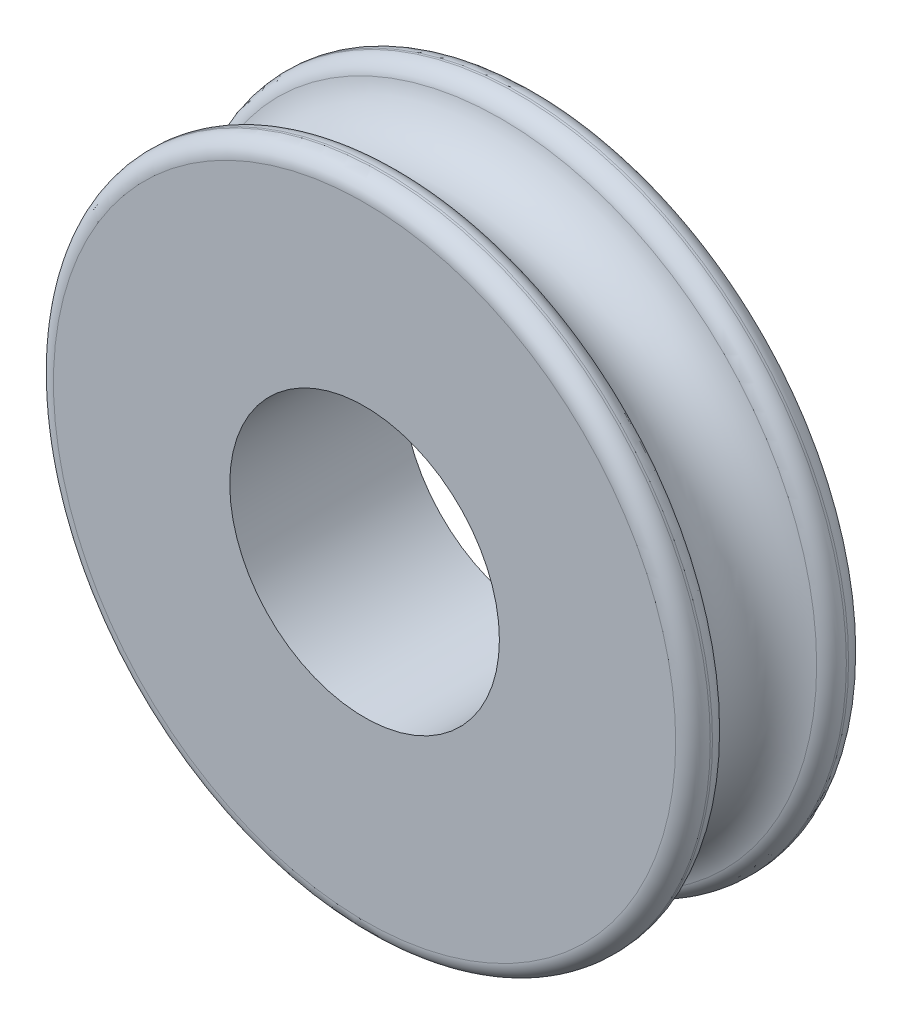
ISO-10303-21;
HEADER;
FILE_DESCRIPTION(('STEP AP214'),'2;1');
FILE_NAME('part.step','',(''),(''),'','','');
FILE_SCHEMA(('AUTOMOTIVE_DESIGN { 1 0 10303 214 1 1 1 1 }'));
ENDSEC;
DATA;
#1=APPLICATION_CONTEXT('core data for automotive mechanical design processes');
#2=APPLICATION_PROTOCOL_DEFINITION('international standard','automotive_design',2000,#1);
#3=PRODUCT_CONTEXT('',#1,'mechanical');
#4=PRODUCT('Part','Part','',(#3));
#5=PRODUCT_RELATED_PRODUCT_CATEGORY('part','',(#4));
#6=PRODUCT_DEFINITION_FORMATION('','',#4);
#7=PRODUCT_DEFINITION_CONTEXT('part definition',#1,'design');
#8=PRODUCT_DEFINITION('design','',#6,#7);
#9=PRODUCT_DEFINITION_SHAPE('','',#8);
#10=(LENGTH_UNIT() NAMED_UNIT(*) SI_UNIT(.MILLI.,.METRE.));
#11=(NAMED_UNIT(*) PLANE_ANGLE_UNIT() SI_UNIT($,.RADIAN.));
#12=(NAMED_UNIT(*) SI_UNIT($,.STERADIAN.) SOLID_ANGLE_UNIT());
#13=UNCERTAINTY_MEASURE_WITH_UNIT(LENGTH_MEASURE(1.E-05),#10,'distance_accuracy_value','');
#14=(GEOMETRIC_REPRESENTATION_CONTEXT(3) GLOBAL_UNCERTAINTY_ASSIGNED_CONTEXT((#13)) GLOBAL_UNIT_ASSIGNED_CONTEXT((#10,
#11,#12)) REPRESENTATION_CONTEXT('',''));
#15=CARTESIAN_POINT('',(0.,0.,0.));
#16=DIRECTION('',(0.,0.,1.));
#17=DIRECTION('',(1.,0.,0.));
#18=AXIS2_PLACEMENT_3D('',#15,#16,#17);
#19=CARTESIAN_POINT('',(0.,0.,2.5));
#20=DIRECTION('',(0.,0.,-1.));
#21=DIRECTION('',(-1.,0.,0.));
#22=AXIS2_PLACEMENT_3D('',#19,#20,#21);
#23=CYLINDRICAL_SURFACE('',#22,9.5);
#24=CARTESIAN_POINT('',(0.,0.,1.93649167310371));
#25=DIRECTION('',(0.,0.,-1.));
#26=DIRECTION('',(-1.,0.,0.));
#27=AXIS2_PLACEMENT_3D('',#24,#25,#26);
#28=CIRCLE('',#27,9.5);
#29=CARTESIAN_POINT('',(9.5,0.,1.93649167310371));
#30=VERTEX_POINT('',#29);
#31=EDGE_CURVE('E69',#30,#30,#28,.F.);
#32=ORIENTED_EDGE('',*,*,#31,.T.);
#33=EDGE_LOOP('',(#32));
#34=FACE_BOUND('',#33,.T.);
#35=CARTESIAN_POINT('',(0.,0.,2.));
#36=DIRECTION('',(0.,0.,1.));
#37=DIRECTION('',(1.,0.,0.));
#38=AXIS2_PLACEMENT_3D('',#35,#36,#37);
#39=CIRCLE('',#38,9.5);
#40=CARTESIAN_POINT('',(9.5,0.,2.));
#41=VERTEX_POINT('',#40);
#42=EDGE_CURVE('E95',#41,#41,#39,.F.);
#43=ORIENTED_EDGE('',*,*,#42,.T.);
#44=EDGE_LOOP('',(#43));
#45=FACE_BOUND('',#44,.T.);
#46=ADVANCED_FACE('F39',(#34,#45),#23,.T.);
#47=CARTESIAN_POINT('',(0.,0.,2.5));
#48=DIRECTION('',(0.,0.,1.));
#49=DIRECTION('',(1.,0.,0.));
#50=AXIS2_PLACEMENT_3D('',#47,#48,#49);
#51=PLANE('',#50);
#52=CARTESIAN_POINT('',(0.,0.,2.5));
#53=DIRECTION('',(0.,0.,1.));
#54=DIRECTION('',(1.,0.,0.));
#55=AXIS2_PLACEMENT_3D('',#52,#53,#54);
#56=CIRCLE('',#55,9.);
#57=CARTESIAN_POINT('',(9.,0.,2.5));
#58=VERTEX_POINT('',#57);
#59=EDGE_CURVE('E99',#58,#58,#56,.T.);
#60=ORIENTED_EDGE('',*,*,#59,.T.);
#61=EDGE_LOOP('',(#60));
#62=FACE_BOUND('',#61,.T.);
#63=CARTESIAN_POINT('',(0.,0.,2.5));
#64=DIRECTION('',(0.,0.,1.));
#65=DIRECTION('',(1.,0.,0.));
#66=AXIS2_PLACEMENT_3D('',#63,#64,#65);
#67=CIRCLE('',#66,3.9);
#68=CARTESIAN_POINT('',(3.9,0.,2.5));
#69=VERTEX_POINT('',#68);
#70=EDGE_CURVE('E103',#69,#69,#67,.T.);
#71=ORIENTED_EDGE('',*,*,#70,.F.);
#72=EDGE_LOOP('',(#71));
#73=FACE_BOUND('',#72,.T.);
#74=ADVANCED_FACE('F114',(#62,#73),#51,.T.);
#75=CARTESIAN_POINT('',(0.,0.,-2.5));
#76=DIRECTION('',(0.,0.,1.));
#77=DIRECTION('',(1.,0.,0.));
#78=AXIS2_PLACEMENT_3D('',#75,#76,#77);
#79=PLANE('',#78);
#80=CARTESIAN_POINT('',(0.,0.,-2.5));
#81=DIRECTION('',(0.,0.,1.));
#82=DIRECTION('',(1.,0.,0.));
#83=AXIS2_PLACEMENT_3D('',#80,#81,#82);
#84=CIRCLE('',#83,9.);
#85=CARTESIAN_POINT('',(9.,0.,-2.5));
#86=VERTEX_POINT('',#85);
#87=EDGE_CURVE('E87',#86,#86,#84,.F.);
#88=ORIENTED_EDGE('',*,*,#87,.T.);
#89=EDGE_LOOP('',(#88));
#90=FACE_BOUND('',#89,.T.);
#91=CARTESIAN_POINT('',(0.,0.,-2.5));
#92=DIRECTION('',(0.,0.,1.));
#93=DIRECTION('',(1.,0.,0.));
#94=AXIS2_PLACEMENT_3D('',#91,#92,#93);
#95=CIRCLE('',#94,3.9);
#96=CARTESIAN_POINT('',(3.9,0.,-2.5));
#97=VERTEX_POINT('',#96);
#98=EDGE_CURVE('E76',#97,#97,#95,.T.);
#99=ORIENTED_EDGE('',*,*,#98,.T.);
#100=EDGE_LOOP('',(#99));
#101=FACE_BOUND('',#100,.T.);
#102=ADVANCED_FACE('F116',(#90,#101),#79,.F.);
#103=CARTESIAN_POINT('',(0.,0.,-1.93649167310371));
#104=DIRECTION('',(0.,0.,1.));
#105=DIRECTION('',(1.,0.,0.));
#106=AXIS2_PLACEMENT_3D('',#103,#104,#105);
#107=CIRCLE('',#106,9.5);
#108=CARTESIAN_POINT('',(9.5,0.,-1.93649167310371));
#109=VERTEX_POINT('',#108);
#110=EDGE_CURVE('E11',#109,#109,#107,.F.);
#111=ORIENTED_EDGE('',*,*,#110,.T.);
#112=EDGE_LOOP('',(#111));
#113=FACE_BOUND('',#112,.T.);
#114=CARTESIAN_POINT('',(0.,0.,-2.));
#115=DIRECTION('',(0.,0.,1.));
#116=DIRECTION('',(1.,0.,0.));
#117=AXIS2_PLACEMENT_3D('',#114,#115,#116);
#118=CIRCLE('',#117,9.5);
#119=CARTESIAN_POINT('',(9.5,0.,-2.));
#120=VERTEX_POINT('',#119);
#121=EDGE_CURVE('E91',#120,#120,#118,.T.);
#122=ORIENTED_EDGE('',*,*,#121,.T.);
#123=EDGE_LOOP('',(#122));
#124=FACE_BOUND('',#123,.T.);
#125=ADVANCED_FACE('F123',(#113,#124),#23,.T.);
#126=CARTESIAN_POINT('',(0.,0.,2.5));
#127=DIRECTION('',(0.,0.,-1.));
#128=DIRECTION('',(-1.,0.,0.));
#129=AXIS2_PLACEMENT_3D('',#126,#127,#128);
#130=CYLINDRICAL_SURFACE('',#129,3.9);
#131=ORIENTED_EDGE('',*,*,#70,.T.);
#132=EDGE_LOOP('',(#131));
#133=FACE_BOUND('',#132,.T.);
#134=ORIENTED_EDGE('',*,*,#98,.F.);
#135=EDGE_LOOP('',(#134));
#136=FACE_BOUND('',#135,.T.);
#137=ADVANCED_FACE('F111',(#133,#136),#130,.F.);
#138=CARTESIAN_POINT('',(0.,0.,0.));
#139=DIRECTION('',(0.,0.,1.));
#140=DIRECTION('',(1.,0.,0.));
#141=AXIS2_PLACEMENT_3D('',#138,#139,#140);
#142=TOROIDAL_SURFACE('',#141,9.5,1.5);
#143=CARTESIAN_POINT('',(9.5,0.,0.));
#144=DIRECTION('',(0.,1.,0.));
#145=DIRECTION('',(0.,0.,1.));
#146=AXIS2_PLACEMENT_3D('',#143,#144,#145);
#147=CIRCLE('',#146,1.5);
#148=CARTESIAN_POINT('',(9.1250000000003,0.,-1.45236875482795));
#149=VERTEX_POINT('',#148);
#150=CARTESIAN_POINT('',(9.1250000000003,0.,1.45236875482795));
#151=VERTEX_POINT('',#150);
#152=EDGE_CURVE('E72',#149,#151,#147,.T.);
#153=ORIENTED_EDGE('',*,*,#152,.T.);
#154=CARTESIAN_POINT('',(0.,0.,1.45236875482795));
#155=DIRECTION('',(0.,0.,-1.));
#156=DIRECTION('',(-1.,0.,0.));
#157=AXIS2_PLACEMENT_3D('',#154,#155,#156);
#158=CIRCLE('',#157,9.12499999999996);
#159=EDGE_CURVE('E49',#151,#151,#158,.T.);
#160=ORIENTED_EDGE('',*,*,#159,.T.);
#161=ORIENTED_EDGE('',*,*,#152,.F.);
#162=CARTESIAN_POINT('',(0.,0.,-1.45236875482795));
#163=DIRECTION('',(0.,0.,1.));
#164=DIRECTION('',(1.,0.,0.));
#165=AXIS2_PLACEMENT_3D('',#162,#163,#164);
#166=CIRCLE('',#165,9.12499999999996);
#167=EDGE_CURVE('E81',#149,#149,#166,.T.);
#168=ORIENTED_EDGE('',*,*,#167,.T.);
#169=EDGE_LOOP('',(#153,#160,#161,#168));
#170=FACE_BOUND('',#169,.T.);
#171=ADVANCED_FACE('F137',(#170),#142,.F.);
#172=CARTESIAN_POINT('',(0.,0.,2.));
#173=DIRECTION('',(0.,0.,1.));
#174=DIRECTION('',(1.,0.,0.));
#175=AXIS2_PLACEMENT_3D('',#172,#173,#174);
#176=TOROIDAL_SURFACE('',#175,9.,0.5);
#177=ORIENTED_EDGE('',*,*,#42,.F.);
#178=EDGE_LOOP('',(#177));
#179=FACE_BOUND('',#178,.T.);
#180=ORIENTED_EDGE('',*,*,#59,.F.);
#181=EDGE_LOOP('',(#180));
#182=FACE_BOUND('',#181,.T.);
#183=ADVANCED_FACE('F133',(#179,#182),#176,.T.);
#184=CARTESIAN_POINT('',(0.,0.,-2.));
#185=DIRECTION('',(0.,0.,1.));
#186=DIRECTION('',(1.,0.,0.));
#187=AXIS2_PLACEMENT_3D('',#184,#185,#186);
#188=TOROIDAL_SURFACE('',#187,9.,0.5);
#189=ORIENTED_EDGE('',*,*,#87,.F.);
#190=EDGE_LOOP('',(#189));
#191=FACE_BOUND('',#190,.T.);
#192=ORIENTED_EDGE('',*,*,#121,.F.);
#193=EDGE_LOOP('',(#192));
#194=FACE_BOUND('',#193,.T.);
#195=ADVANCED_FACE('F136',(#191,#194),#188,.T.);
#196=CARTESIAN_POINT('',(0.,0.,1.93649167310371));
#197=DIRECTION('',(0.,0.,-1.));
#198=DIRECTION('',(-1.,0.,0.));
#199=AXIS2_PLACEMENT_3D('',#196,#197,#198);
#200=TOROIDAL_SURFACE('',#199,9.,0.5);
#201=CARTESIAN_POINT('',(9.,0.,1.93649167310371));
#202=DIRECTION('',(0.,-1.,0.));
#203=DIRECTION('',(0.,0.,-1.));
#204=AXIS2_PLACEMENT_3D('',#201,#202,#203);
#205=CIRCLE('',#204,0.5);
#206=EDGE_CURVE('E63',#151,#30,#205,.T.);
#207=ORIENTED_EDGE('',*,*,#206,.F.);
#208=ORIENTED_EDGE('',*,*,#159,.F.);
#209=ORIENTED_EDGE('',*,*,#206,.T.);
#210=ORIENTED_EDGE('',*,*,#31,.F.);
#211=EDGE_LOOP('',(#207,#208,#209,#210));
#212=FACE_BOUND('',#211,.T.);
#213=ADVANCED_FACE('F67',(#212),#200,.T.);
#214=CARTESIAN_POINT('',(0.,0.,-1.93649167310371));
#215=DIRECTION('',(0.,0.,1.));
#216=DIRECTION('',(1.,0.,0.));
#217=AXIS2_PLACEMENT_3D('',#214,#215,#216);
#218=TOROIDAL_SURFACE('',#217,9.,0.5);
#219=CARTESIAN_POINT('',(9.,0.,-1.93649167310371));
#220=DIRECTION('',(0.,1.,0.));
#221=DIRECTION('',(0.,0.,1.));
#222=AXIS2_PLACEMENT_3D('',#219,#220,#221);
#223=CIRCLE('',#222,0.5);
#224=EDGE_CURVE('E43',#149,#109,#223,.T.);
#225=ORIENTED_EDGE('',*,*,#224,.F.);
#226=ORIENTED_EDGE('',*,*,#167,.F.);
#227=ORIENTED_EDGE('',*,*,#224,.T.);
#228=ORIENTED_EDGE('',*,*,#110,.F.);
#229=EDGE_LOOP('',(#225,#226,#227,#228));
#230=FACE_BOUND('',#229,.T.);
#231=ADVANCED_FACE('F41',(#230),#218,.T.);
#232=CLOSED_SHELL('',(#46,#74,#102,#125,#137,#171,#183,#195,#213,#231));
#233=MANIFOLD_SOLID_BREP('B2',#232);
#234=ADVANCED_BREP_SHAPE_REPRESENTATION('',(#18,#233),#14);
#235=SHAPE_DEFINITION_REPRESENTATION(#9,#234);
ENDSEC;
END-ISO-10303-21;
